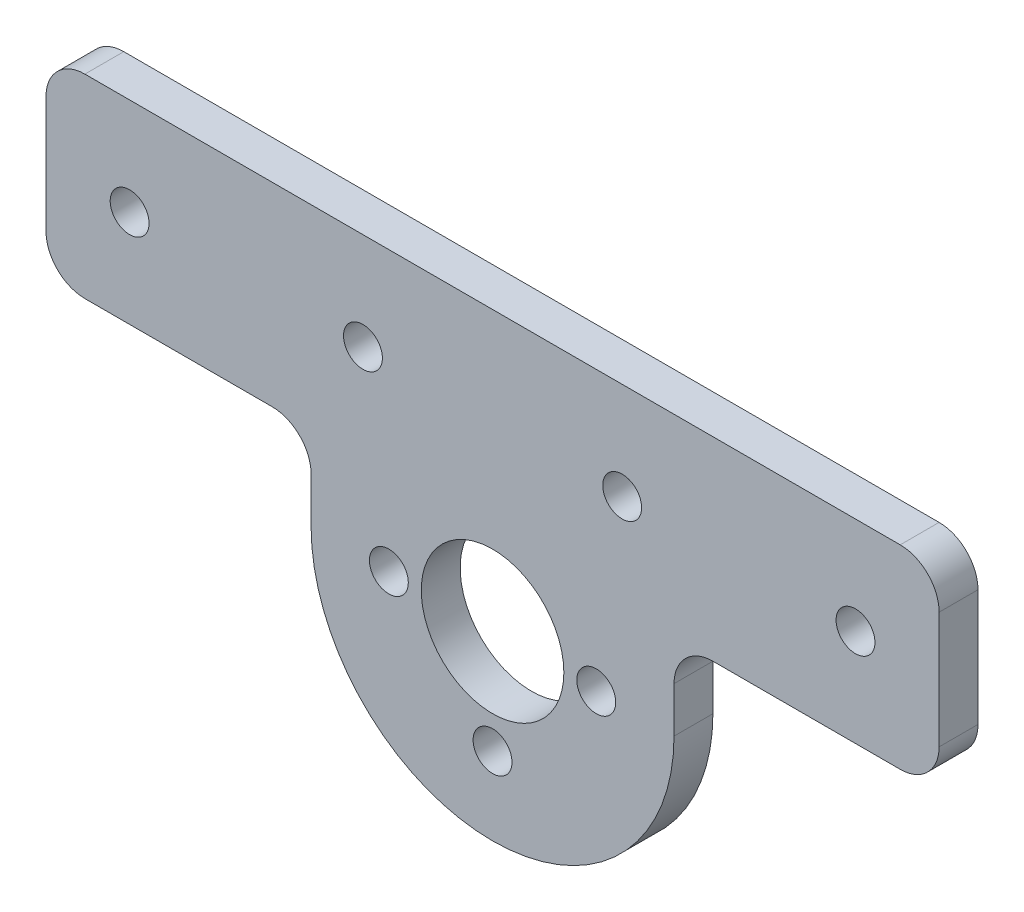
ISO-10303-21;
HEADER;
FILE_DESCRIPTION(('STEP AP214'),'2;1');
FILE_NAME('part.step','',(''),(''),'','','');
FILE_SCHEMA(('AUTOMOTIVE_DESIGN { 1 0 10303 214 1 1 1 1 }'));
ENDSEC;
DATA;
#1=APPLICATION_CONTEXT('core data for automotive mechanical design processes');
#2=APPLICATION_PROTOCOL_DEFINITION('international standard','automotive_design',2000,#1);
#3=PRODUCT_CONTEXT('',#1,'mechanical');
#4=PRODUCT('Part','Part','',(#3));
#5=PRODUCT_RELATED_PRODUCT_CATEGORY('part','',(#4));
#6=PRODUCT_DEFINITION_FORMATION('','',#4);
#7=PRODUCT_DEFINITION_CONTEXT('part definition',#1,'design');
#8=PRODUCT_DEFINITION('design','',#6,#7);
#9=PRODUCT_DEFINITION_SHAPE('','',#8);
#10=(LENGTH_UNIT() NAMED_UNIT(*) SI_UNIT(.MILLI.,.METRE.));
#11=(NAMED_UNIT(*) PLANE_ANGLE_UNIT() SI_UNIT($,.RADIAN.));
#12=(NAMED_UNIT(*) SI_UNIT($,.STERADIAN.) SOLID_ANGLE_UNIT());
#13=UNCERTAINTY_MEASURE_WITH_UNIT(LENGTH_MEASURE(1.E-05),#10,'distance_accuracy_value','');
#14=(GEOMETRIC_REPRESENTATION_CONTEXT(3) GLOBAL_UNCERTAINTY_ASSIGNED_CONTEXT((#13)) GLOBAL_UNIT_ASSIGNED_CONTEXT((#10,
#11,#12)) REPRESENTATION_CONTEXT('',''));
#15=CARTESIAN_POINT('',(0.,0.,0.));
#16=DIRECTION('',(0.,0.,1.));
#17=DIRECTION('',(1.,0.,0.));
#18=AXIS2_PLACEMENT_3D('',#15,#16,#17);
#19=CARTESIAN_POINT('',(-14.,0.,3.));
#20=DIRECTION('',(-1.,0.,0.));
#21=DIRECTION('',(0.,0.,1.));
#22=AXIS2_PLACEMENT_3D('',#19,#20,#21);
#23=PLANE('',#22);
#24=DIRECTION('',(0.,1.,0.));
#25=VECTOR('',#24,1.);
#26=CARTESIAN_POINT('',(-14.,0.,3.));
#27=LINE('',#26,#25);
#28=CARTESIAN_POINT('',(-14.,0.,3.));
#29=VERTEX_POINT('',#28);
#30=CARTESIAN_POINT('',(-14.,3.50752158147125,3.));
#31=VERTEX_POINT('',#30);
#32=EDGE_CURVE('E148',#29,#31,#27,.T.);
#33=ORIENTED_EDGE('',*,*,#32,.T.);
#34=DIRECTION('',(0.,0.,1.));
#35=VECTOR('',#34,1.);
#36=CARTESIAN_POINT('',(-14.,3.50752158147125,0.));
#37=LINE('',#36,#35);
#38=CARTESIAN_POINT('',(-14.,3.50752158147125,0.));
#39=VERTEX_POINT('',#38);
#40=EDGE_CURVE('E292',#31,#39,#37,.F.);
#41=ORIENTED_EDGE('',*,*,#40,.T.);
#42=DIRECTION('',(0.,1.,0.));
#43=VECTOR('',#42,1.);
#44=CARTESIAN_POINT('',(-14.,0.,0.));
#45=LINE('',#44,#43);
#46=CARTESIAN_POINT('',(-14.,0.,0.));
#47=VERTEX_POINT('',#46);
#48=EDGE_CURVE('E151',#47,#39,#45,.T.);
#49=ORIENTED_EDGE('',*,*,#48,.F.);
#50=DIRECTION('',(0.,0.,-1.));
#51=VECTOR('',#50,1.);
#52=CARTESIAN_POINT('',(-14.,0.,3.));
#53=LINE('',#52,#51);
#54=EDGE_CURVE('E145',#29,#47,#53,.T.);
#55=ORIENTED_EDGE('',*,*,#54,.F.);
#56=EDGE_LOOP('',(#33,#41,#49,#55));
#57=FACE_BOUND('',#56,.T.);
#58=ADVANCED_FACE('F45',(#57),#23,.T.);
#59=CARTESIAN_POINT('',(0.,0.,3.));
#60=DIRECTION('',(0.,0.,-1.));
#61=DIRECTION('',(-1.,0.,0.));
#62=AXIS2_PLACEMENT_3D('',#59,#60,#61);
#63=CYLINDRICAL_SURFACE('',#62,14.);
#64=CARTESIAN_POINT('',(0.,0.,0.));
#65=DIRECTION('',(0.,0.,1.));
#66=DIRECTION('',(1.,0.,0.));
#67=AXIS2_PLACEMENT_3D('',#64,#65,#66);
#68=CIRCLE('',#67,14.);
#69=CARTESIAN_POINT('',(14.,0.,0.));
#70=VERTEX_POINT('',#69);
#71=EDGE_CURVE('E201',#47,#70,#68,.T.);
#72=ORIENTED_EDGE('',*,*,#71,.T.);
#73=DIRECTION('',(0.,0.,-1.));
#74=VECTOR('',#73,1.);
#75=CARTESIAN_POINT('',(14.,0.,3.));
#76=LINE('',#75,#74);
#77=CARTESIAN_POINT('',(14.,0.,3.));
#78=VERTEX_POINT('',#77);
#79=EDGE_CURVE('E157',#78,#70,#76,.T.);
#80=ORIENTED_EDGE('',*,*,#79,.F.);
#81=CARTESIAN_POINT('',(0.,0.,3.));
#82=DIRECTION('',(0.,0.,1.));
#83=DIRECTION('',(1.,0.,0.));
#84=AXIS2_PLACEMENT_3D('',#81,#82,#83);
#85=CIRCLE('',#84,14.);
#86=EDGE_CURVE('E161',#29,#78,#85,.T.);
#87=ORIENTED_EDGE('',*,*,#86,.F.);
#88=ORIENTED_EDGE('',*,*,#54,.T.);
#89=EDGE_LOOP('',(#72,#80,#87,#88));
#90=FACE_BOUND('',#89,.T.);
#91=ADVANCED_FACE('F162',(#90),#63,.T.);
#92=CARTESIAN_POINT('',(14.,0.,3.));
#93=DIRECTION('',(1.,0.,0.));
#94=DIRECTION('',(0.,0.,-1.));
#95=AXIS2_PLACEMENT_3D('',#92,#93,#94);
#96=PLANE('',#95);
#97=DIRECTION('',(0.,-1.,0.));
#98=VECTOR('',#97,1.);
#99=CARTESIAN_POINT('',(14.,0.,0.));
#100=LINE('',#99,#98);
#101=CARTESIAN_POINT('',(14.,3.50752158147125,0.));
#102=VERTEX_POINT('',#101);
#103=EDGE_CURVE('E205',#102,#70,#100,.T.);
#104=ORIENTED_EDGE('',*,*,#103,.F.);
#105=DIRECTION('',(0.,0.,-1.));
#106=VECTOR('',#105,1.);
#107=CARTESIAN_POINT('',(14.,3.50752158147125,3.));
#108=LINE('',#107,#106);
#109=CARTESIAN_POINT('',(14.,3.50752158147125,3.));
#110=VERTEX_POINT('',#109);
#111=EDGE_CURVE('E295',#102,#110,#108,.F.);
#112=ORIENTED_EDGE('',*,*,#111,.T.);
#113=DIRECTION('',(0.,-1.,0.));
#114=VECTOR('',#113,1.);
#115=CARTESIAN_POINT('',(14.,0.,3.));
#116=LINE('',#115,#114);
#117=EDGE_CURVE('E167',#110,#78,#116,.T.);
#118=ORIENTED_EDGE('',*,*,#117,.T.);
#119=ORIENTED_EDGE('',*,*,#79,.T.);
#120=EDGE_LOOP('',(#104,#112,#118,#119));
#121=FACE_BOUND('',#120,.T.);
#122=ADVANCED_FACE('F339',(#121),#96,.T.);
#123=CARTESIAN_POINT('',(8.,0.,3.));
#124=DIRECTION('',(0.,0.,-1.));
#125=DIRECTION('',(-1.,0.,0.));
#126=AXIS2_PLACEMENT_3D('',#123,#124,#125);
#127=CYLINDRICAL_SURFACE('',#126,1.5);
#128=CARTESIAN_POINT('',(8.,0.,3.));
#129=DIRECTION('',(0.,0.,1.));
#130=DIRECTION('',(1.,0.,0.));
#131=AXIS2_PLACEMENT_3D('',#128,#129,#130);
#132=CIRCLE('',#131,1.5);
#133=CARTESIAN_POINT('',(9.5,0.,3.));
#134=VERTEX_POINT('',#133);
#135=EDGE_CURVE('E191',#134,#134,#132,.T.);
#136=ORIENTED_EDGE('',*,*,#135,.T.);
#137=EDGE_LOOP('',(#136));
#138=FACE_BOUND('',#137,.T.);
#139=CARTESIAN_POINT('',(8.,0.,0.));
#140=DIRECTION('',(0.,0.,1.));
#141=DIRECTION('',(1.,0.,0.));
#142=AXIS2_PLACEMENT_3D('',#139,#140,#141);
#143=CIRCLE('',#142,1.5);
#144=CARTESIAN_POINT('',(9.5,0.,0.));
#145=VERTEX_POINT('',#144);
#146=EDGE_CURVE('E179',#145,#145,#143,.T.);
#147=ORIENTED_EDGE('',*,*,#146,.F.);
#148=EDGE_LOOP('',(#147));
#149=FACE_BOUND('',#148,.T.);
#150=ADVANCED_FACE('F470',(#138,#149),#127,.F.);
#151=CARTESIAN_POINT('',(0.,-8.,3.));
#152=DIRECTION('',(0.,0.,-1.));
#153=DIRECTION('',(-1.,0.,0.));
#154=AXIS2_PLACEMENT_3D('',#151,#152,#153);
#155=CYLINDRICAL_SURFACE('',#154,1.5);
#156=CARTESIAN_POINT('',(0.,-8.,3.));
#157=DIRECTION('',(0.,0.,1.));
#158=DIRECTION('',(1.,0.,0.));
#159=AXIS2_PLACEMENT_3D('',#156,#157,#158);
#160=CIRCLE('',#159,1.5);
#161=CARTESIAN_POINT('',(1.5,-8.,3.));
#162=VERTEX_POINT('',#161);
#163=EDGE_CURVE('E187',#162,#162,#160,.T.);
#164=ORIENTED_EDGE('',*,*,#163,.T.);
#165=EDGE_LOOP('',(#164));
#166=FACE_BOUND('',#165,.T.);
#167=CARTESIAN_POINT('',(0.,-8.,0.));
#168=DIRECTION('',(0.,0.,1.));
#169=DIRECTION('',(1.,0.,0.));
#170=AXIS2_PLACEMENT_3D('',#167,#168,#169);
#171=CIRCLE('',#170,1.5);
#172=CARTESIAN_POINT('',(1.5,-8.,0.));
#173=VERTEX_POINT('',#172);
#174=EDGE_CURVE('E208',#173,#173,#171,.T.);
#175=ORIENTED_EDGE('',*,*,#174,.F.);
#176=EDGE_LOOP('',(#175));
#177=FACE_BOUND('',#176,.T.);
#178=ADVANCED_FACE('F468',(#166,#177),#155,.F.);
#179=CARTESIAN_POINT('',(-8.,0.,3.));
#180=DIRECTION('',(0.,0.,-1.));
#181=DIRECTION('',(-1.,0.,0.));
#182=AXIS2_PLACEMENT_3D('',#179,#180,#181);
#183=CYLINDRICAL_SURFACE('',#182,1.5);
#184=CARTESIAN_POINT('',(-8.,0.,3.));
#185=DIRECTION('',(0.,0.,1.));
#186=DIRECTION('',(1.,0.,0.));
#187=AXIS2_PLACEMENT_3D('',#184,#185,#186);
#188=CIRCLE('',#187,1.5);
#189=CARTESIAN_POINT('',(-6.5,0.,3.));
#190=VERTEX_POINT('',#189);
#191=EDGE_CURVE('E195',#190,#190,#188,.T.);
#192=ORIENTED_EDGE('',*,*,#191,.T.);
#193=EDGE_LOOP('',(#192));
#194=FACE_BOUND('',#193,.T.);
#195=CARTESIAN_POINT('',(-8.,0.,0.));
#196=DIRECTION('',(0.,0.,1.));
#197=DIRECTION('',(1.,0.,0.));
#198=AXIS2_PLACEMENT_3D('',#195,#196,#197);
#199=CIRCLE('',#198,1.5);
#200=CARTESIAN_POINT('',(-6.5,0.,0.));
#201=VERTEX_POINT('',#200);
#202=EDGE_CURVE('E175',#201,#201,#199,.T.);
#203=ORIENTED_EDGE('',*,*,#202,.F.);
#204=EDGE_LOOP('',(#203));
#205=FACE_BOUND('',#204,.T.);
#206=ADVANCED_FACE('F400',(#194,#205),#183,.F.);
#207=CARTESIAN_POINT('',(0.,0.,3.));
#208=DIRECTION('',(0.,0.,1.));
#209=DIRECTION('',(1.,0.,0.));
#210=AXIS2_PLACEMENT_3D('',#207,#208,#209);
#211=PLANE('',#210);
#212=DIRECTION('',(1.,0.,0.));
#213=VECTOR('',#212,1.);
#214=CARTESIAN_POINT('',(22.0404249414808,21.5075215814713,3.));
#215=LINE('',#214,#213);
#216=CARTESIAN_POINT('',(-31.450975213728,21.5075215814713,3.));
#217=VERTEX_POINT('',#216);
#218=CARTESIAN_POINT('',(31.450975213728,21.5075215814713,3.));
#219=VERTEX_POINT('',#218);
#220=EDGE_CURVE('E233',#217,#219,#215,.T.);
#221=ORIENTED_EDGE('',*,*,#220,.F.);
#222=CARTESIAN_POINT('',(-31.450975213728,18.5075215814713,3.));
#223=DIRECTION('',(0.,0.,1.));
#224=DIRECTION('',(1.,0.,0.));
#225=AXIS2_PLACEMENT_3D('',#222,#223,#224);
#226=CIRCLE('',#225,3.);
#227=CARTESIAN_POINT('',(-34.450975213728,18.5075215814713,3.));
#228=VERTEX_POINT('',#227);
#229=EDGE_CURVE('E249',#217,#228,#226,.T.);
#230=ORIENTED_EDGE('',*,*,#229,.T.);
#231=DIRECTION('',(0.,-1.,0.));
#232=VECTOR('',#231,1.);
#233=CARTESIAN_POINT('',(-34.450975213728,21.5075215814713,3.));
#234=LINE('',#233,#232);
#235=CARTESIAN_POINT('',(-34.4509752137281,9.50752158147128,3.));
#236=VERTEX_POINT('',#235);
#237=EDGE_CURVE('E369',#228,#236,#234,.T.);
#238=ORIENTED_EDGE('',*,*,#237,.T.);
#239=CARTESIAN_POINT('',(-31.4509752137281,9.50752158147124,3.));
#240=DIRECTION('',(0.,0.,1.));
#241=DIRECTION('',(1.,0.,0.));
#242=AXIS2_PLACEMENT_3D('',#239,#240,#241);
#243=CIRCLE('',#242,3.);
#244=CARTESIAN_POINT('',(-31.4509752137281,6.50752158147124,3.));
#245=VERTEX_POINT('',#244);
#246=EDGE_CURVE('E240',#236,#245,#243,.T.);
#247=ORIENTED_EDGE('',*,*,#246,.T.);
#248=DIRECTION('',(1.,0.,0.));
#249=VECTOR('',#248,1.);
#250=CARTESIAN_POINT('',(34.4509752137281,6.50752158147126,3.));
#251=LINE('',#250,#249);
#252=CARTESIAN_POINT('',(-17.,6.50752158147125,3.));
#253=VERTEX_POINT('',#252);
#254=EDGE_CURVE('E368',#245,#253,#251,.T.);
#255=ORIENTED_EDGE('',*,*,#254,.T.);
#256=CARTESIAN_POINT('',(-17.,3.50752158147125,3.));
#257=DIRECTION('',(0.,0.,1.));
#258=DIRECTION('',(1.,0.,0.));
#259=AXIS2_PLACEMENT_3D('',#256,#257,#258);
#260=CIRCLE('',#259,3.);
#261=EDGE_CURVE('E173',#253,#31,#260,.F.);
#262=ORIENTED_EDGE('',*,*,#261,.T.);
#263=ORIENTED_EDGE('',*,*,#32,.F.);
#264=ORIENTED_EDGE('',*,*,#86,.T.);
#265=ORIENTED_EDGE('',*,*,#117,.F.);
#266=CARTESIAN_POINT('',(17.,3.50752158147125,3.));
#267=DIRECTION('',(0.,0.,1.));
#268=DIRECTION('',(1.,0.,0.));
#269=AXIS2_PLACEMENT_3D('',#266,#267,#268);
#270=CIRCLE('',#269,3.);
#271=CARTESIAN_POINT('',(17.,6.50752158147125,3.));
#272=VERTEX_POINT('',#271);
#273=EDGE_CURVE('E11',#110,#272,#270,.F.);
#274=ORIENTED_EDGE('',*,*,#273,.T.);
#275=CARTESIAN_POINT('',(31.4509752137281,6.50752158147125,3.));
#276=VERTEX_POINT('',#275);
#277=EDGE_CURVE('E362',#272,#276,#251,.T.);
#278=ORIENTED_EDGE('',*,*,#277,.T.);
#279=CARTESIAN_POINT('',(31.4509752137281,9.50752158147125,3.));
#280=DIRECTION('',(0.,0.,1.));
#281=DIRECTION('',(1.,0.,0.));
#282=AXIS2_PLACEMENT_3D('',#279,#280,#281);
#283=CIRCLE('',#282,3.);
#284=CARTESIAN_POINT('',(34.4509752137281,9.50752158147129,3.));
#285=VERTEX_POINT('',#284);
#286=EDGE_CURVE('E243',#276,#285,#283,.T.);
#287=ORIENTED_EDGE('',*,*,#286,.T.);
#288=DIRECTION('',(0.,1.,0.));
#289=VECTOR('',#288,1.);
#290=CARTESIAN_POINT('',(34.450975213728,21.5075215814713,3.));
#291=LINE('',#290,#289);
#292=CARTESIAN_POINT('',(34.450975213728,18.5075215814713,3.));
#293=VERTEX_POINT('',#292);
#294=EDGE_CURVE('E373',#285,#293,#291,.T.);
#295=ORIENTED_EDGE('',*,*,#294,.T.);
#296=CARTESIAN_POINT('',(31.450975213728,18.5075215814713,3.));
#297=DIRECTION('',(0.,0.,1.));
#298=DIRECTION('',(1.,0.,0.));
#299=AXIS2_PLACEMENT_3D('',#296,#297,#298);
#300=CIRCLE('',#299,3.);
#301=EDGE_CURVE('E246',#293,#219,#300,.T.);
#302=ORIENTED_EDGE('',*,*,#301,.T.);
#303=EDGE_LOOP('',(#221,#230,#238,#247,#255,#262,#263,#264,#265,#274,#278,#287,#295,#302));
#304=FACE_BOUND('',#303,.T.);
#305=CARTESIAN_POINT('',(0.,0.,3.));
#306=DIRECTION('',(0.,0.,1.));
#307=DIRECTION('',(1.,0.,0.));
#308=AXIS2_PLACEMENT_3D('',#305,#306,#307);
#309=CIRCLE('',#308,5.5);
#310=CARTESIAN_POINT('',(5.5,0.,3.));
#311=VERTEX_POINT('',#310);
#312=EDGE_CURVE('E182',#311,#311,#309,.T.);
#313=ORIENTED_EDGE('',*,*,#312,.F.);
#314=EDGE_LOOP('',(#313));
#315=FACE_BOUND('',#314,.T.);
#316=ORIENTED_EDGE('',*,*,#163,.F.);
#317=EDGE_LOOP('',(#316));
#318=FACE_BOUND('',#317,.T.);
#319=ORIENTED_EDGE('',*,*,#135,.F.);
#320=EDGE_LOOP('',(#319));
#321=FACE_BOUND('',#320,.T.);
#322=ORIENTED_EDGE('',*,*,#191,.F.);
#323=EDGE_LOOP('',(#322));
#324=FACE_BOUND('',#323,.T.);
#325=CARTESIAN_POINT('',(-10.,14.0075215814713,3.));
#326=DIRECTION('',(0.,0.,1.));
#327=DIRECTION('',(1.,0.,0.));
#328=AXIS2_PLACEMENT_3D('',#325,#326,#327);
#329=CIRCLE('',#328,1.5);
#330=CARTESIAN_POINT('',(-8.5,14.0075215814713,3.));
#331=VERTEX_POINT('',#330);
#332=EDGE_CURVE('E385',#331,#331,#329,.T.);
#333=ORIENTED_EDGE('',*,*,#332,.F.);
#334=EDGE_LOOP('',(#333));
#335=FACE_BOUND('',#334,.T.);
#336=CARTESIAN_POINT('',(10.,14.0075215814713,3.));
#337=DIRECTION('',(0.,0.,1.));
#338=DIRECTION('',(1.,0.,0.));
#339=AXIS2_PLACEMENT_3D('',#336,#337,#338);
#340=CIRCLE('',#339,1.5);
#341=CARTESIAN_POINT('',(11.5,14.0075215814713,3.));
#342=VERTEX_POINT('',#341);
#343=EDGE_CURVE('E229',#342,#342,#340,.T.);
#344=ORIENTED_EDGE('',*,*,#343,.F.);
#345=EDGE_LOOP('',(#344));
#346=FACE_BOUND('',#345,.T.);
#347=CARTESIAN_POINT('',(28.,14.0075215814713,3.));
#348=DIRECTION('',(0.,0.,1.));
#349=DIRECTION('',(1.,0.,0.));
#350=AXIS2_PLACEMENT_3D('',#347,#348,#349);
#351=CIRCLE('',#350,1.5);
#352=CARTESIAN_POINT('',(29.5,14.0075215814713,3.));
#353=VERTEX_POINT('',#352);
#354=EDGE_CURVE('E415',#353,#353,#351,.T.);
#355=ORIENTED_EDGE('',*,*,#354,.F.);
#356=EDGE_LOOP('',(#355));
#357=FACE_BOUND('',#356,.T.);
#358=CARTESIAN_POINT('',(-28.,14.0075215814713,3.));
#359=DIRECTION('',(0.,0.,1.));
#360=DIRECTION('',(-1.,0.,0.));
#361=AXIS2_PLACEMENT_3D('',#358,#359,#360);
#362=CIRCLE('',#361,1.5);
#363=CARTESIAN_POINT('',(-29.5,14.0075215814713,3.));
#364=VERTEX_POINT('',#363);
#365=EDGE_CURVE('E418',#364,#364,#362,.T.);
#366=ORIENTED_EDGE('',*,*,#365,.F.);
#367=EDGE_LOOP('',(#366));
#368=FACE_BOUND('',#367,.T.);
#369=ADVANCED_FACE('F170',(#304,#315,#318,#321,#324,#335,#346,#357,#368),#211,.T.);
#370=CARTESIAN_POINT('',(0.,0.,0.));
#371=DIRECTION('',(0.,0.,1.));
#372=DIRECTION('',(1.,0.,0.));
#373=AXIS2_PLACEMENT_3D('',#370,#371,#372);
#374=PLANE('',#373);
#375=CARTESIAN_POINT('',(0.,0.,0.));
#376=DIRECTION('',(0.,0.,1.));
#377=DIRECTION('',(1.,0.,0.));
#378=AXIS2_PLACEMENT_3D('',#375,#376,#377);
#379=CIRCLE('',#378,5.5);
#380=CARTESIAN_POINT('',(5.5,0.,0.));
#381=VERTEX_POINT('',#380);
#382=EDGE_CURVE('E202',#381,#381,#379,.T.);
#383=ORIENTED_EDGE('',*,*,#382,.T.);
#384=EDGE_LOOP('',(#383));
#385=FACE_BOUND('',#384,.T.);
#386=DIRECTION('',(0.,-1.,0.));
#387=VECTOR('',#386,1.);
#388=CARTESIAN_POINT('',(-34.450975213728,21.5075215814713,0.));
#389=LINE('',#388,#387);
#390=CARTESIAN_POINT('',(-34.450975213728,18.5075215814713,0.));
#391=VERTEX_POINT('',#390);
#392=CARTESIAN_POINT('',(-34.4509752137281,9.50752158147128,0.));
#393=VERTEX_POINT('',#392);
#394=EDGE_CURVE('E381',#391,#393,#389,.T.);
#395=ORIENTED_EDGE('',*,*,#394,.F.);
#396=CARTESIAN_POINT('',(-31.450975213728,18.5075215814713,0.));
#397=DIRECTION('',(0.,0.,1.));
#398=DIRECTION('',(1.,0.,0.));
#399=AXIS2_PLACEMENT_3D('',#396,#397,#398);
#400=CIRCLE('',#399,3.);
#401=CARTESIAN_POINT('',(-31.450975213728,21.5075215814713,0.));
#402=VERTEX_POINT('',#401);
#403=EDGE_CURVE('E267',#391,#402,#400,.F.);
#404=ORIENTED_EDGE('',*,*,#403,.T.);
#405=DIRECTION('',(1.,0.,0.));
#406=VECTOR('',#405,1.);
#407=CARTESIAN_POINT('',(0.,21.5075215814713,0.));
#408=LINE('',#407,#406);
#409=CARTESIAN_POINT('',(31.450975213728,21.5075215814713,0.));
#410=VERTEX_POINT('',#409);
#411=EDGE_CURVE('E156',#402,#410,#408,.T.);
#412=ORIENTED_EDGE('',*,*,#411,.T.);
#413=CARTESIAN_POINT('',(31.450975213728,18.5075215814713,0.));
#414=DIRECTION('',(0.,0.,1.));
#415=DIRECTION('',(1.,0.,0.));
#416=AXIS2_PLACEMENT_3D('',#413,#414,#415);
#417=CIRCLE('',#416,3.);
#418=CARTESIAN_POINT('',(34.450975213728,18.5075215814713,0.));
#419=VERTEX_POINT('',#418);
#420=EDGE_CURVE('E264',#410,#419,#417,.F.);
#421=ORIENTED_EDGE('',*,*,#420,.T.);
#422=DIRECTION('',(0.,1.,0.));
#423=VECTOR('',#422,1.);
#424=CARTESIAN_POINT('',(34.450975213728,21.5075215814713,0.));
#425=LINE('',#424,#423);
#426=CARTESIAN_POINT('',(34.4509752137281,9.50752158147129,0.));
#427=VERTEX_POINT('',#426);
#428=EDGE_CURVE('E318',#427,#419,#425,.T.);
#429=ORIENTED_EDGE('',*,*,#428,.F.);
#430=CARTESIAN_POINT('',(31.4509752137281,9.50752158147125,0.));
#431=DIRECTION('',(0.,0.,1.));
#432=DIRECTION('',(1.,0.,0.));
#433=AXIS2_PLACEMENT_3D('',#430,#431,#432);
#434=CIRCLE('',#433,3.);
#435=CARTESIAN_POINT('',(31.4509752137281,6.50752158147124,0.));
#436=VERTEX_POINT('',#435);
#437=EDGE_CURVE('E66',#427,#436,#434,.F.);
#438=ORIENTED_EDGE('',*,*,#437,.T.);
#439=DIRECTION('',(1.,0.,0.));
#440=VECTOR('',#439,1.);
#441=CARTESIAN_POINT('',(-34.4509752137281,6.50752158147126,0.));
#442=LINE('',#441,#440);
#443=CARTESIAN_POINT('',(17.,6.50752158147125,0.));
#444=VERTEX_POINT('',#443);
#445=EDGE_CURVE('E319',#444,#436,#442,.T.);
#446=ORIENTED_EDGE('',*,*,#445,.F.);
#447=CARTESIAN_POINT('',(17.,3.50752158147125,0.));
#448=DIRECTION('',(0.,0.,1.));
#449=DIRECTION('',(1.,0.,0.));
#450=AXIS2_PLACEMENT_3D('',#447,#448,#449);
#451=CIRCLE('',#450,3.);
#452=EDGE_CURVE('E54',#444,#102,#451,.T.);
#453=ORIENTED_EDGE('',*,*,#452,.T.);
#454=ORIENTED_EDGE('',*,*,#103,.T.);
#455=ORIENTED_EDGE('',*,*,#71,.F.);
#456=ORIENTED_EDGE('',*,*,#48,.T.);
#457=CARTESIAN_POINT('',(-17.,3.50752158147125,0.));
#458=DIRECTION('',(0.,0.,1.));
#459=DIRECTION('',(1.,0.,0.));
#460=AXIS2_PLACEMENT_3D('',#457,#458,#459);
#461=CIRCLE('',#460,3.);
#462=CARTESIAN_POINT('',(-17.,6.50752158147125,0.));
#463=VERTEX_POINT('',#462);
#464=EDGE_CURVE('E300',#39,#463,#461,.T.);
#465=ORIENTED_EDGE('',*,*,#464,.T.);
#466=CARTESIAN_POINT('',(-31.4509752137281,6.50752158147125,0.));
#467=VERTEX_POINT('',#466);
#468=EDGE_CURVE('E309',#467,#463,#442,.T.);
#469=ORIENTED_EDGE('',*,*,#468,.F.);
#470=CARTESIAN_POINT('',(-31.4509752137281,9.50752158147124,0.));
#471=DIRECTION('',(0.,0.,1.));
#472=DIRECTION('',(1.,0.,0.));
#473=AXIS2_PLACEMENT_3D('',#470,#471,#472);
#474=CIRCLE('',#473,3.);
#475=EDGE_CURVE('E259',#467,#393,#474,.F.);
#476=ORIENTED_EDGE('',*,*,#475,.T.);
#477=EDGE_LOOP('',(#395,#404,#412,#421,#429,#438,#446,#453,#454,#455,#456,#465,#469,#476));
#478=FACE_BOUND('',#477,.T.);
#479=ORIENTED_EDGE('',*,*,#174,.T.);
#480=EDGE_LOOP('',(#479));
#481=FACE_BOUND('',#480,.T.);
#482=ORIENTED_EDGE('',*,*,#146,.T.);
#483=EDGE_LOOP('',(#482));
#484=FACE_BOUND('',#483,.T.);
#485=ORIENTED_EDGE('',*,*,#202,.T.);
#486=EDGE_LOOP('',(#485));
#487=FACE_BOUND('',#486,.T.);
#488=CARTESIAN_POINT('',(-10.,14.0075215814713,0.));
#489=DIRECTION('',(0.,0.,1.));
#490=DIRECTION('',(1.,0.,0.));
#491=AXIS2_PLACEMENT_3D('',#488,#489,#490);
#492=CIRCLE('',#491,1.5);
#493=CARTESIAN_POINT('',(-8.5,14.0075215814713,0.));
#494=VERTEX_POINT('',#493);
#495=EDGE_CURVE('E224',#494,#494,#492,.T.);
#496=ORIENTED_EDGE('',*,*,#495,.T.);
#497=EDGE_LOOP('',(#496));
#498=FACE_BOUND('',#497,.T.);
#499=CARTESIAN_POINT('',(10.,14.0075215814713,0.));
#500=DIRECTION('',(0.,0.,1.));
#501=DIRECTION('',(1.,0.,0.));
#502=AXIS2_PLACEMENT_3D('',#499,#500,#501);
#503=CIRCLE('',#502,1.5);
#504=CARTESIAN_POINT('',(11.5,14.0075215814713,0.));
#505=VERTEX_POINT('',#504);
#506=EDGE_CURVE('E228',#505,#505,#503,.T.);
#507=ORIENTED_EDGE('',*,*,#506,.T.);
#508=EDGE_LOOP('',(#507));
#509=FACE_BOUND('',#508,.T.);
#510=CARTESIAN_POINT('',(28.,14.0075215814713,0.));
#511=DIRECTION('',(0.,0.,1.));
#512=DIRECTION('',(1.,0.,0.));
#513=AXIS2_PLACEMENT_3D('',#510,#511,#512);
#514=CIRCLE('',#513,1.5);
#515=CARTESIAN_POINT('',(29.5,14.0075215814713,0.));
#516=VERTEX_POINT('',#515);
#517=EDGE_CURVE('E375',#516,#516,#514,.T.);
#518=ORIENTED_EDGE('',*,*,#517,.T.);
#519=EDGE_LOOP('',(#518));
#520=FACE_BOUND('',#519,.T.);
#521=CARTESIAN_POINT('',(-28.,14.0075215814713,0.));
#522=DIRECTION('',(0.,0.,1.));
#523=DIRECTION('',(-1.,0.,0.));
#524=AXIS2_PLACEMENT_3D('',#521,#522,#523);
#525=CIRCLE('',#524,1.5);
#526=CARTESIAN_POINT('',(-29.5,14.0075215814713,0.));
#527=VERTEX_POINT('',#526);
#528=EDGE_CURVE('E421',#527,#527,#525,.T.);
#529=ORIENTED_EDGE('',*,*,#528,.T.);
#530=EDGE_LOOP('',(#529));
#531=FACE_BOUND('',#530,.T.);
#532=ADVANCED_FACE('F307',(#385,#478,#481,#484,#487,#498,#509,#520,#531),#374,.F.);
#533=CARTESIAN_POINT('',(0.,0.,-8.));
#534=DIRECTION('',(0.,0.,1.));
#535=DIRECTION('',(1.,0.,0.));
#536=AXIS2_PLACEMENT_3D('',#533,#534,#535);
#537=CYLINDRICAL_SURFACE('',#536,5.5);
#538=ORIENTED_EDGE('',*,*,#312,.T.);
#539=EDGE_LOOP('',(#538));
#540=FACE_BOUND('',#539,.T.);
#541=ORIENTED_EDGE('',*,*,#382,.F.);
#542=EDGE_LOOP('',(#541));
#543=FACE_BOUND('',#542,.T.);
#544=ADVANCED_FACE('F396',(#540,#543),#537,.F.);
#545=CARTESIAN_POINT('',(22.0404249414808,21.5075215814713,-8.));
#546=DIRECTION('',(0.,-1.,0.));
#547=DIRECTION('',(1.,0.,0.));
#548=AXIS2_PLACEMENT_3D('',#545,#546,#547);
#549=PLANE('',#548);
#550=ORIENTED_EDGE('',*,*,#411,.F.);
#551=DIRECTION('',(0.,0.,1.));
#552=VECTOR('',#551,1.);
#553=CARTESIAN_POINT('',(-31.450975213728,21.5075215814713,3.));
#554=LINE('',#553,#552);
#555=EDGE_CURVE('E236',#402,#217,#554,.T.);
#556=ORIENTED_EDGE('',*,*,#555,.T.);
#557=ORIENTED_EDGE('',*,*,#220,.T.);
#558=DIRECTION('',(0.,0.,1.));
#559=VECTOR('',#558,1.);
#560=CARTESIAN_POINT('',(31.450975213728,21.5075215814713,0.));
#561=LINE('',#560,#559);
#562=EDGE_CURVE('E223',#219,#410,#561,.F.);
#563=ORIENTED_EDGE('',*,*,#562,.T.);
#564=EDGE_LOOP('',(#550,#556,#557,#563));
#565=FACE_BOUND('',#564,.T.);
#566=ADVANCED_FACE('F449',(#565),#549,.F.);
#567=CARTESIAN_POINT('',(-10.,14.0075215814713,-8.));
#568=DIRECTION('',(0.,0.,1.));
#569=DIRECTION('',(1.,0.,0.));
#570=AXIS2_PLACEMENT_3D('',#567,#568,#569);
#571=CYLINDRICAL_SURFACE('',#570,1.5);
#572=ORIENTED_EDGE('',*,*,#332,.T.);
#573=EDGE_LOOP('',(#572));
#574=FACE_BOUND('',#573,.T.);
#575=ORIENTED_EDGE('',*,*,#495,.F.);
#576=EDGE_LOOP('',(#575));
#577=FACE_BOUND('',#576,.T.);
#578=ADVANCED_FACE('F451',(#574,#577),#571,.F.);
#579=CARTESIAN_POINT('',(10.,14.0075215814713,-8.));
#580=DIRECTION('',(0.,0.,1.));
#581=DIRECTION('',(1.,0.,0.));
#582=AXIS2_PLACEMENT_3D('',#579,#580,#581);
#583=CYLINDRICAL_SURFACE('',#582,1.5);
#584=ORIENTED_EDGE('',*,*,#343,.T.);
#585=EDGE_LOOP('',(#584));
#586=FACE_BOUND('',#585,.T.);
#587=ORIENTED_EDGE('',*,*,#506,.F.);
#588=EDGE_LOOP('',(#587));
#589=FACE_BOUND('',#588,.T.);
#590=ADVANCED_FACE('F457',(#586,#589),#583,.F.);
#591=CARTESIAN_POINT('',(28.,14.0075215814713,0.));
#592=DIRECTION('',(0.,0.,1.));
#593=DIRECTION('',(1.,0.,0.));
#594=AXIS2_PLACEMENT_3D('',#591,#592,#593);
#595=CYLINDRICAL_SURFACE('',#594,1.5);
#596=ORIENTED_EDGE('',*,*,#517,.F.);
#597=EDGE_LOOP('',(#596));
#598=FACE_BOUND('',#597,.T.);
#599=ORIENTED_EDGE('',*,*,#354,.T.);
#600=EDGE_LOOP('',(#599));
#601=FACE_BOUND('',#600,.T.);
#602=ADVANCED_FACE('F509',(#598,#601),#595,.F.);
#603=CARTESIAN_POINT('',(34.450975213728,21.5075215814713,0.));
#604=DIRECTION('',(1.,0.,0.));
#605=DIRECTION('',(0.,1.,0.));
#606=AXIS2_PLACEMENT_3D('',#603,#604,#605);
#607=PLANE('',#606);
#608=ORIENTED_EDGE('',*,*,#428,.T.);
#609=DIRECTION('',(0.,0.,1.));
#610=VECTOR('',#609,1.);
#611=CARTESIAN_POINT('',(34.450975213728,18.5075215814713,3.));
#612=LINE('',#611,#610);
#613=EDGE_CURVE('E273',#419,#293,#612,.T.);
#614=ORIENTED_EDGE('',*,*,#613,.T.);
#615=ORIENTED_EDGE('',*,*,#294,.F.);
#616=DIRECTION('',(0.,0.,1.));
#617=VECTOR('',#616,1.);
#618=CARTESIAN_POINT('',(34.4509752137281,9.50752158147129,0.));
#619=LINE('',#618,#617);
#620=EDGE_CURVE('E270',#285,#427,#619,.F.);
#621=ORIENTED_EDGE('',*,*,#620,.T.);
#622=EDGE_LOOP('',(#608,#614,#615,#621));
#623=FACE_BOUND('',#622,.T.);
#624=ADVANCED_FACE('F439',(#623),#607,.T.);
#625=CARTESIAN_POINT('',(34.4509752137281,6.50752158147126,0.));
#626=DIRECTION('',(0.,-1.,0.));
#627=DIRECTION('',(1.,0.,0.));
#628=AXIS2_PLACEMENT_3D('',#625,#626,#627);
#629=PLANE('',#628);
#630=ORIENTED_EDGE('',*,*,#445,.T.);
#631=DIRECTION('',(0.,0.,1.));
#632=VECTOR('',#631,1.);
#633=CARTESIAN_POINT('',(31.4509752137281,6.50752158147125,0.));
#634=LINE('',#633,#632);
#635=EDGE_CURVE('E281',#436,#276,#634,.T.);
#636=ORIENTED_EDGE('',*,*,#635,.T.);
#637=ORIENTED_EDGE('',*,*,#277,.F.);
#638=DIRECTION('',(0.,0.,-1.));
#639=VECTOR('',#638,1.);
#640=CARTESIAN_POINT('',(17.,6.50752158147125,0.));
#641=LINE('',#640,#639);
#642=EDGE_CURVE('E277',#272,#444,#641,.T.);
#643=ORIENTED_EDGE('',*,*,#642,.T.);
#644=EDGE_LOOP('',(#630,#636,#637,#643));
#645=FACE_BOUND('',#644,.T.);
#646=ADVANCED_FACE('F361',(#645),#629,.T.);
#647=ORIENTED_EDGE('',*,*,#254,.F.);
#648=DIRECTION('',(0.,0.,1.));
#649=VECTOR('',#648,1.);
#650=CARTESIAN_POINT('',(-31.4509752137281,6.50752158147124,0.));
#651=LINE('',#650,#649);
#652=EDGE_CURVE('E289',#245,#467,#651,.F.);
#653=ORIENTED_EDGE('',*,*,#652,.T.);
#654=ORIENTED_EDGE('',*,*,#468,.T.);
#655=DIRECTION('',(0.,0.,1.));
#656=VECTOR('',#655,1.);
#657=CARTESIAN_POINT('',(-17.,6.50752158147125,3.));
#658=LINE('',#657,#656);
#659=EDGE_CURVE('E285',#463,#253,#658,.T.);
#660=ORIENTED_EDGE('',*,*,#659,.T.);
#661=EDGE_LOOP('',(#647,#653,#654,#660));
#662=FACE_BOUND('',#661,.T.);
#663=ADVANCED_FACE('F315',(#662),#629,.T.);
#664=CARTESIAN_POINT('',(-34.450975213728,21.5075215814713,0.));
#665=DIRECTION('',(-1.,0.,0.));
#666=DIRECTION('',(0.,-1.,0.));
#667=AXIS2_PLACEMENT_3D('',#664,#665,#666);
#668=PLANE('',#667);
#669=ORIENTED_EDGE('',*,*,#237,.F.);
#670=DIRECTION('',(0.,0.,1.));
#671=VECTOR('',#670,1.);
#672=CARTESIAN_POINT('',(-34.450975213728,18.5075215814713,0.));
#673=LINE('',#672,#671);
#674=EDGE_CURVE('E256',#228,#391,#673,.F.);
#675=ORIENTED_EDGE('',*,*,#674,.T.);
#676=ORIENTED_EDGE('',*,*,#394,.T.);
#677=DIRECTION('',(0.,0.,1.));
#678=VECTOR('',#677,1.);
#679=CARTESIAN_POINT('',(-34.4509752137281,9.50752158147128,0.));
#680=LINE('',#679,#678);
#681=EDGE_CURVE('E252',#393,#236,#680,.T.);
#682=ORIENTED_EDGE('',*,*,#681,.T.);
#683=EDGE_LOOP('',(#669,#675,#676,#682));
#684=FACE_BOUND('',#683,.T.);
#685=ADVANCED_FACE('F445',(#684),#668,.T.);
#686=CARTESIAN_POINT('',(-28.,14.0075215814713,0.));
#687=DIRECTION('',(0.,0.,1.));
#688=DIRECTION('',(1.,0.,0.));
#689=AXIS2_PLACEMENT_3D('',#686,#687,#688);
#690=CYLINDRICAL_SURFACE('',#689,1.5);
#691=ORIENTED_EDGE('',*,*,#528,.F.);
#692=EDGE_LOOP('',(#691));
#693=FACE_BOUND('',#692,.T.);
#694=ORIENTED_EDGE('',*,*,#365,.T.);
#695=EDGE_LOOP('',(#694));
#696=FACE_BOUND('',#695,.T.);
#697=ADVANCED_FACE('F347',(#693,#696),#690,.F.);
#698=CARTESIAN_POINT('',(-31.450975213728,18.5075215814713,-8.));
#699=DIRECTION('',(0.,0.,-1.));
#700=DIRECTION('',(-1.,0.,0.));
#701=AXIS2_PLACEMENT_3D('',#698,#699,#700);
#702=CYLINDRICAL_SURFACE('',#701,3.);
#703=ORIENTED_EDGE('',*,*,#403,.F.);
#704=ORIENTED_EDGE('',*,*,#674,.F.);
#705=ORIENTED_EDGE('',*,*,#229,.F.);
#706=ORIENTED_EDGE('',*,*,#555,.F.);
#707=EDGE_LOOP('',(#703,#704,#705,#706));
#708=FACE_BOUND('',#707,.T.);
#709=ADVANCED_FACE('F343',(#708),#702,.T.);
#710=CARTESIAN_POINT('',(31.450975213728,18.5075215814713,0.));
#711=DIRECTION('',(0.,0.,-1.));
#712=DIRECTION('',(-1.,0.,0.));
#713=AXIS2_PLACEMENT_3D('',#710,#711,#712);
#714=CYLINDRICAL_SURFACE('',#713,3.);
#715=ORIENTED_EDGE('',*,*,#420,.F.);
#716=ORIENTED_EDGE('',*,*,#562,.F.);
#717=ORIENTED_EDGE('',*,*,#301,.F.);
#718=ORIENTED_EDGE('',*,*,#613,.F.);
#719=EDGE_LOOP('',(#715,#716,#717,#718));
#720=FACE_BOUND('',#719,.T.);
#721=ADVANCED_FACE('F346',(#720),#714,.T.);
#722=CARTESIAN_POINT('',(31.4509752137281,9.50752158147125,0.));
#723=DIRECTION('',(0.,0.,1.));
#724=DIRECTION('',(1.,0.,0.));
#725=AXIS2_PLACEMENT_3D('',#722,#723,#724);
#726=CYLINDRICAL_SURFACE('',#725,3.);
#727=ORIENTED_EDGE('',*,*,#437,.F.);
#728=ORIENTED_EDGE('',*,*,#620,.F.);
#729=ORIENTED_EDGE('',*,*,#286,.F.);
#730=ORIENTED_EDGE('',*,*,#635,.F.);
#731=EDGE_LOOP('',(#727,#728,#729,#730));
#732=FACE_BOUND('',#731,.T.);
#733=ADVANCED_FACE('F329',(#732),#726,.T.);
#734=CARTESIAN_POINT('',(-31.4509752137281,9.50752158147124,0.));
#735=DIRECTION('',(0.,0.,1.));
#736=DIRECTION('',(1.,0.,0.));
#737=AXIS2_PLACEMENT_3D('',#734,#735,#736);
#738=CYLINDRICAL_SURFACE('',#737,3.);
#739=ORIENTED_EDGE('',*,*,#475,.F.);
#740=ORIENTED_EDGE('',*,*,#652,.F.);
#741=ORIENTED_EDGE('',*,*,#246,.F.);
#742=ORIENTED_EDGE('',*,*,#681,.F.);
#743=EDGE_LOOP('',(#739,#740,#741,#742));
#744=FACE_BOUND('',#743,.T.);
#745=ADVANCED_FACE('F323',(#744),#738,.T.);
#746=CARTESIAN_POINT('',(-17.,3.50752158147125,0.));
#747=DIRECTION('',(0.,0.,-1.));
#748=DIRECTION('',(-1.,0.,0.));
#749=AXIS2_PLACEMENT_3D('',#746,#747,#748);
#750=CYLINDRICAL_SURFACE('',#749,3.);
#751=ORIENTED_EDGE('',*,*,#464,.F.);
#752=ORIENTED_EDGE('',*,*,#40,.F.);
#753=ORIENTED_EDGE('',*,*,#261,.F.);
#754=ORIENTED_EDGE('',*,*,#659,.F.);
#755=EDGE_LOOP('',(#751,#752,#753,#754));
#756=FACE_BOUND('',#755,.T.);
#757=ADVANCED_FACE('F321',(#756),#750,.F.);
#758=CARTESIAN_POINT('',(17.,3.50752158147125,0.));
#759=DIRECTION('',(0.,0.,1.));
#760=DIRECTION('',(1.,0.,0.));
#761=AXIS2_PLACEMENT_3D('',#758,#759,#760);
#762=CYLINDRICAL_SURFACE('',#761,3.);
#763=ORIENTED_EDGE('',*,*,#273,.F.);
#764=ORIENTED_EDGE('',*,*,#111,.F.);
#765=ORIENTED_EDGE('',*,*,#452,.F.);
#766=ORIENTED_EDGE('',*,*,#642,.F.);
#767=EDGE_LOOP('',(#763,#764,#765,#766));
#768=FACE_BOUND('',#767,.T.);
#769=ADVANCED_FACE('F47',(#768),#762,.F.);
#770=CLOSED_SHELL('',(#58,#91,#122,#150,#178,#206,#369,#532,#544,#566,#578,#590,#602,#624,#646,
#663,#685,#697,#709,#721,#733,#745,#757,#769));
#771=MANIFOLD_SOLID_BREP('B2',#770);
#772=ADVANCED_BREP_SHAPE_REPRESENTATION('',(#18,#771),#14);
#773=SHAPE_DEFINITION_REPRESENTATION(#9,#772);
ENDSEC;
END-ISO-10303-21;
